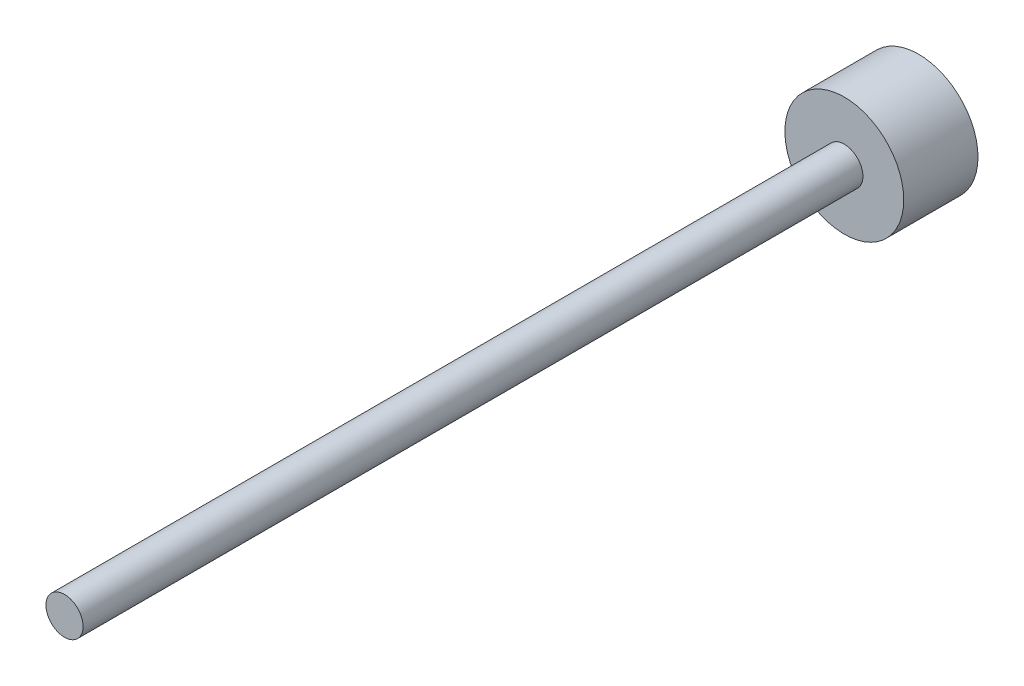
ISO-10303-21;
HEADER;
FILE_DESCRIPTION(('STEP AP214'),'2;1');
FILE_NAME('part.step','',(''),(''),'','','');
FILE_SCHEMA(('AUTOMOTIVE_DESIGN { 1 0 10303 214 1 1 1 1 }'));
ENDSEC;
DATA;
#1=APPLICATION_CONTEXT('core data for automotive mechanical design processes');
#2=APPLICATION_PROTOCOL_DEFINITION('international standard','automotive_design',2000,#1);
#3=PRODUCT_CONTEXT('',#1,'mechanical');
#4=PRODUCT('Part','Part','',(#3));
#5=PRODUCT_RELATED_PRODUCT_CATEGORY('part','',(#4));
#6=PRODUCT_DEFINITION_FORMATION('','',#4);
#7=PRODUCT_DEFINITION_CONTEXT('part definition',#1,'design');
#8=PRODUCT_DEFINITION('design','',#6,#7);
#9=PRODUCT_DEFINITION_SHAPE('','',#8);
#10=(LENGTH_UNIT() NAMED_UNIT(*) SI_UNIT(.MILLI.,.METRE.));
#11=(NAMED_UNIT(*) PLANE_ANGLE_UNIT() SI_UNIT($,.RADIAN.));
#12=(NAMED_UNIT(*) SI_UNIT($,.STERADIAN.) SOLID_ANGLE_UNIT());
#13=UNCERTAINTY_MEASURE_WITH_UNIT(LENGTH_MEASURE(1.E-05),#10,'distance_accuracy_value','');
#14=(GEOMETRIC_REPRESENTATION_CONTEXT(3) GLOBAL_UNCERTAINTY_ASSIGNED_CONTEXT((#13)) GLOBAL_UNIT_ASSIGNED_CONTEXT((#10,
#11,#12)) REPRESENTATION_CONTEXT('',''));
#15=CARTESIAN_POINT('',(0.,0.,0.));
#16=DIRECTION('',(0.,0.,1.));
#17=DIRECTION('',(1.,0.,0.));
#18=AXIS2_PLACEMENT_3D('',#15,#16,#17);
#19=CARTESIAN_POINT('',(0.,0.,10.));
#20=DIRECTION('',(0.,0.,1.));
#21=DIRECTION('',(1.,0.,0.));
#22=AXIS2_PLACEMENT_3D('',#19,#20,#21);
#23=PLANE('',#22);
#24=CARTESIAN_POINT('',(0.,0.,10.));
#25=DIRECTION('',(0.,0.,1.));
#26=DIRECTION('',(1.,0.,0.));
#27=AXIS2_PLACEMENT_3D('',#24,#25,#26);
#28=CIRCLE('',#27,8.);
#29=CARTESIAN_POINT('',(8.,0.,10.));
#30=VERTEX_POINT('',#29);
#31=EDGE_CURVE('E10',#30,#30,#28,.T.);
#32=ORIENTED_EDGE('',*,*,#31,.T.);
#33=EDGE_LOOP('',(#32));
#34=FACE_BOUND('',#33,.T.);
#35=CARTESIAN_POINT('',(0.,0.,10.));
#36=DIRECTION('',(0.,0.,1.));
#37=DIRECTION('',(1.,0.,0.));
#38=AXIS2_PLACEMENT_3D('',#35,#36,#37);
#39=CIRCLE('',#38,2.5);
#40=CARTESIAN_POINT('',(2.5,0.,10.));
#41=VERTEX_POINT('',#40);
#42=EDGE_CURVE('E46',#41,#41,#39,.T.);
#43=ORIENTED_EDGE('',*,*,#42,.F.);
#44=EDGE_LOOP('',(#43));
#45=FACE_BOUND('',#44,.T.);
#46=ADVANCED_FACE('F33',(#34,#45),#23,.T.);
#47=CARTESIAN_POINT('',(0.,0.,10.));
#48=DIRECTION('',(0.,0.,-1.));
#49=DIRECTION('',(-1.,0.,0.));
#50=AXIS2_PLACEMENT_3D('',#47,#48,#49);
#51=CYLINDRICAL_SURFACE('',#50,8.);
#52=ORIENTED_EDGE('',*,*,#31,.F.);
#53=EDGE_LOOP('',(#52));
#54=FACE_BOUND('',#53,.T.);
#55=CARTESIAN_POINT('',(0.,0.,0.));
#56=DIRECTION('',(0.,0.,1.));
#57=DIRECTION('',(1.,0.,0.));
#58=AXIS2_PLACEMENT_3D('',#55,#56,#57);
#59=CIRCLE('',#58,8.);
#60=CARTESIAN_POINT('',(8.,0.,0.));
#61=VERTEX_POINT('',#60);
#62=EDGE_CURVE('E37',#61,#61,#59,.T.);
#63=ORIENTED_EDGE('',*,*,#62,.T.);
#64=EDGE_LOOP('',(#63));
#65=FACE_BOUND('',#64,.T.);
#66=ADVANCED_FACE('F35',(#54,#65),#51,.T.);
#67=CARTESIAN_POINT('',(0.,0.,0.));
#68=DIRECTION('',(0.,0.,1.));
#69=DIRECTION('',(1.,0.,0.));
#70=AXIS2_PLACEMENT_3D('',#67,#68,#69);
#71=PLANE('',#70);
#72=ORIENTED_EDGE('',*,*,#62,.F.);
#73=EDGE_LOOP('',(#72));
#74=FACE_BOUND('',#73,.T.);
#75=ADVANCED_FACE('F57',(#74),#71,.F.);
#76=CARTESIAN_POINT('',(0.,0.,115.));
#77=DIRECTION('',(0.,0.,-1.));
#78=DIRECTION('',(-1.,0.,0.));
#79=AXIS2_PLACEMENT_3D('',#76,#77,#78);
#80=CYLINDRICAL_SURFACE('',#79,2.5);
#81=CARTESIAN_POINT('',(0.,0.,115.));
#82=DIRECTION('',(0.,0.,1.));
#83=DIRECTION('',(1.,0.,0.));
#84=AXIS2_PLACEMENT_3D('',#81,#82,#83);
#85=CIRCLE('',#84,2.5);
#86=CARTESIAN_POINT('',(2.5,0.,115.));
#87=VERTEX_POINT('',#86);
#88=EDGE_CURVE('E44',#87,#87,#85,.T.);
#89=ORIENTED_EDGE('',*,*,#88,.F.);
#90=EDGE_LOOP('',(#89));
#91=FACE_BOUND('',#90,.T.);
#92=ORIENTED_EDGE('',*,*,#42,.T.);
#93=EDGE_LOOP('',(#92));
#94=FACE_BOUND('',#93,.T.);
#95=ADVANCED_FACE('F54',(#91,#94),#80,.T.);
#96=CARTESIAN_POINT('',(0.,0.,115.));
#97=DIRECTION('',(0.,0.,1.));
#98=DIRECTION('',(1.,0.,0.));
#99=AXIS2_PLACEMENT_3D('',#96,#97,#98);
#100=PLANE('',#99);
#101=ORIENTED_EDGE('',*,*,#88,.T.);
#102=EDGE_LOOP('',(#101));
#103=FACE_BOUND('',#102,.T.);
#104=ADVANCED_FACE('F52',(#103),#100,.T.);
#105=CLOSED_SHELL('',(#46,#66,#75,#95,#104));
#106=MANIFOLD_SOLID_BREP('B2',#105);
#107=ADVANCED_BREP_SHAPE_REPRESENTATION('',(#18,#106),#14);
#108=SHAPE_DEFINITION_REPRESENTATION(#9,#107);
ENDSEC;
END-ISO-10303-21;
